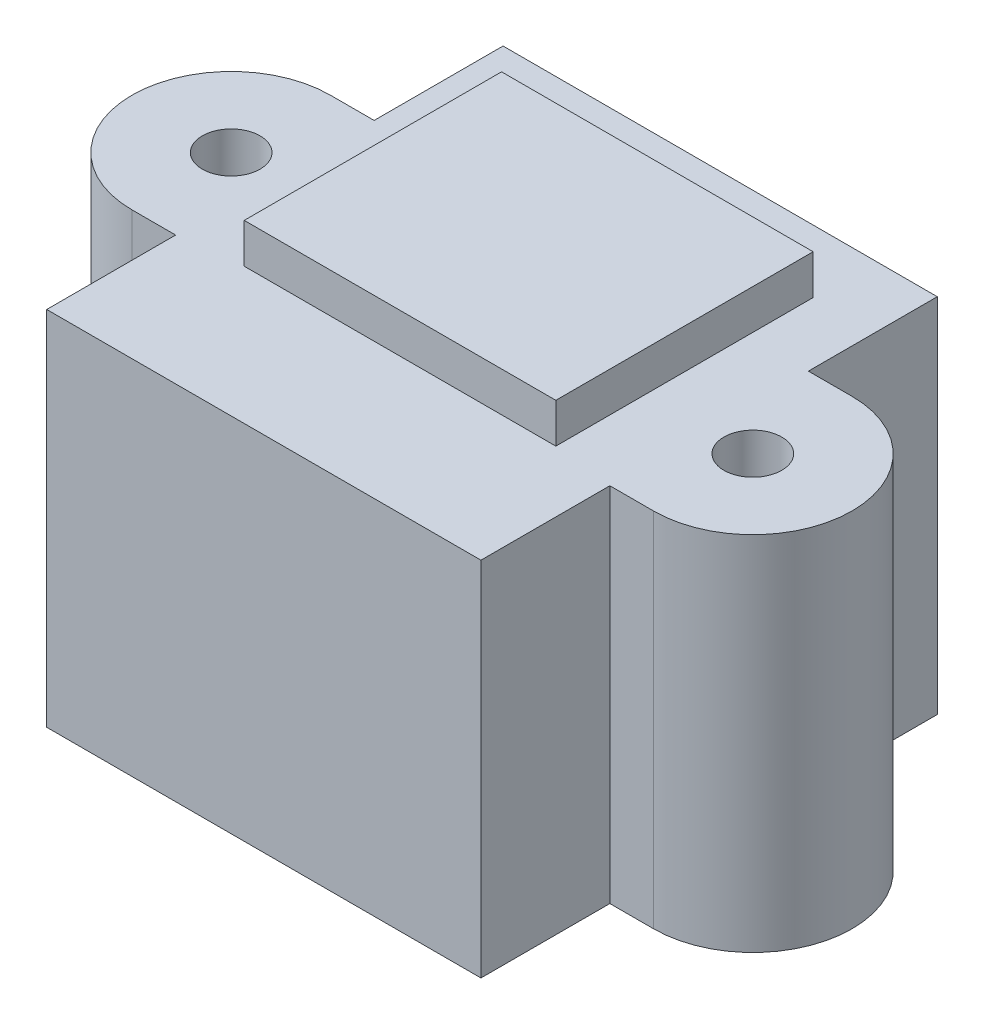
ISO-10303-21;
HEADER;
FILE_DESCRIPTION(('STEP AP214'),'2;1');
FILE_NAME('part.step','',(''),(''),'','','');
FILE_SCHEMA(('AUTOMOTIVE_DESIGN { 1 0 10303 214 1 1 1 1 }'));
ENDSEC;
DATA;
#1=APPLICATION_CONTEXT('core data for automotive mechanical design processes');
#2=APPLICATION_PROTOCOL_DEFINITION('international standard','automotive_design',2000,#1);
#3=PRODUCT_CONTEXT('',#1,'mechanical');
#4=PRODUCT('Part','Part','',(#3));
#5=PRODUCT_RELATED_PRODUCT_CATEGORY('part','',(#4));
#6=PRODUCT_DEFINITION_FORMATION('','',#4);
#7=PRODUCT_DEFINITION_CONTEXT('part definition',#1,'design');
#8=PRODUCT_DEFINITION('design','',#6,#7);
#9=PRODUCT_DEFINITION_SHAPE('','',#8);
#10=(LENGTH_UNIT() NAMED_UNIT(*) SI_UNIT(.MILLI.,.METRE.));
#11=(NAMED_UNIT(*) PLANE_ANGLE_UNIT() SI_UNIT($,.RADIAN.));
#12=(NAMED_UNIT(*) SI_UNIT($,.STERADIAN.) SOLID_ANGLE_UNIT());
#13=UNCERTAINTY_MEASURE_WITH_UNIT(LENGTH_MEASURE(1.E-05),#10,'distance_accuracy_value','');
#14=(GEOMETRIC_REPRESENTATION_CONTEXT(3) GLOBAL_UNCERTAINTY_ASSIGNED_CONTEXT((#13)) GLOBAL_UNIT_ASSIGNED_CONTEXT((#10,
#11,#12)) REPRESENTATION_CONTEXT('',''));
#15=CARTESIAN_POINT('',(0.,0.,0.));
#16=DIRECTION('',(0.,0.,1.));
#17=DIRECTION('',(1.,0.,0.));
#18=AXIS2_PLACEMENT_3D('',#15,#16,#17);
#19=CARTESIAN_POINT('',(0.,18.288,0.));
#20=DIRECTION('',(0.,1.,0.));
#21=DIRECTION('',(0.,0.,1.));
#22=AXIS2_PLACEMENT_3D('',#19,#20,#21);
#23=PLANE('',#22);
#24=CARTESIAN_POINT('',(13.1826,18.288,0.));
#25=DIRECTION('',(0.,1.,0.));
#26=DIRECTION('',(0.,0.,1.));
#27=AXIS2_PLACEMENT_3D('',#24,#25,#26);
#28=CIRCLE('',#27,1.4605);
#29=CARTESIAN_POINT('',(13.1826,18.288,1.4605));
#30=VERTEX_POINT('',#29);
#31=EDGE_CURVE('E290',#30,#30,#28,.T.);
#32=ORIENTED_EDGE('',*,*,#31,.F.);
#33=EDGE_LOOP('',(#32));
#34=FACE_BOUND('',#33,.T.);
#35=CARTESIAN_POINT('',(-13.1826,18.288,0.));
#36=DIRECTION('',(0.,1.,0.));
#37=DIRECTION('',(0.,0.,1.));
#38=AXIS2_PLACEMENT_3D('',#35,#36,#37);
#39=CIRCLE('',#38,1.4605);
#40=CARTESIAN_POINT('',(-13.1826,18.288,1.4605));
#41=VERTEX_POINT('',#40);
#42=EDGE_CURVE('E284',#41,#41,#39,.T.);
#43=ORIENTED_EDGE('',*,*,#42,.F.);
#44=EDGE_LOOP('',(#43));
#45=FACE_BOUND('',#44,.T.);
#46=DIRECTION('',(1.,0.,0.));
#47=VECTOR('',#46,1.);
#48=CARTESIAN_POINT('',(0.,18.288,-5.0165));
#49=LINE('',#48,#47);
#50=CARTESIAN_POINT('',(-13.1826,18.288,-5.0165));
#51=VERTEX_POINT('',#50);
#52=CARTESIAN_POINT('',(-10.9728,18.288,-5.0165));
#53=VERTEX_POINT('',#52);
#54=EDGE_CURVE('E194',#51,#53,#49,.T.);
#55=ORIENTED_EDGE('',*,*,#54,.F.);
#56=CARTESIAN_POINT('',(-13.1826,18.288,0.));
#57=DIRECTION('',(0.,1.,0.));
#58=DIRECTION('',(0.,0.,1.));
#59=AXIS2_PLACEMENT_3D('',#56,#57,#58);
#60=CIRCLE('',#59,5.0165);
#61=CARTESIAN_POINT('',(-13.1826,18.288,5.0165));
#62=VERTEX_POINT('',#61);
#63=EDGE_CURVE('E236',#51,#62,#60,.T.);
#64=ORIENTED_EDGE('',*,*,#63,.T.);
#65=DIRECTION('',(1.,0.,0.));
#66=VECTOR('',#65,1.);
#67=CARTESIAN_POINT('',(0.,18.288,5.0165));
#68=LINE('',#67,#66);
#69=CARTESIAN_POINT('',(-10.9728,18.288,5.0165));
#70=VERTEX_POINT('',#69);
#71=EDGE_CURVE('E218',#62,#70,#68,.T.);
#72=ORIENTED_EDGE('',*,*,#71,.T.);
#73=DIRECTION('',(0.,0.,-1.));
#74=VECTOR('',#73,1.);
#75=CARTESIAN_POINT('',(-10.9728,18.288,0.));
#76=LINE('',#75,#74);
#77=CARTESIAN_POINT('',(-10.9728,18.288,11.5316));
#78=VERTEX_POINT('',#77);
#79=EDGE_CURVE('E231',#78,#70,#76,.T.);
#80=ORIENTED_EDGE('',*,*,#79,.F.);
#81=DIRECTION('',(1.,0.,0.));
#82=VECTOR('',#81,1.);
#83=CARTESIAN_POINT('',(0.,18.288,11.5316));
#84=LINE('',#83,#82);
#85=CARTESIAN_POINT('',(10.9728,18.288,11.5316));
#86=VERTEX_POINT('',#85);
#87=EDGE_CURVE('E232',#78,#86,#84,.T.);
#88=ORIENTED_EDGE('',*,*,#87,.T.);
#89=DIRECTION('',(0.,0.,-1.));
#90=VECTOR('',#89,1.);
#91=CARTESIAN_POINT('',(10.9728,18.288,0.));
#92=LINE('',#91,#90);
#93=CARTESIAN_POINT('',(10.9728,18.288,5.0165));
#94=VERTEX_POINT('',#93);
#95=EDGE_CURVE('E234',#86,#94,#92,.T.);
#96=ORIENTED_EDGE('',*,*,#95,.T.);
#97=DIRECTION('',(1.,0.,0.));
#98=VECTOR('',#97,1.);
#99=CARTESIAN_POINT('',(0.,18.288,5.0165));
#100=LINE('',#99,#98);
#101=CARTESIAN_POINT('',(13.1826,18.288,5.0165));
#102=VERTEX_POINT('',#101);
#103=EDGE_CURVE('E241',#94,#102,#100,.T.);
#104=ORIENTED_EDGE('',*,*,#103,.T.);
#105=CARTESIAN_POINT('',(13.1826,18.288,0.));
#106=DIRECTION('',(0.,1.,0.));
#107=DIRECTION('',(0.,0.,1.));
#108=AXIS2_PLACEMENT_3D('',#105,#106,#107);
#109=CIRCLE('',#108,5.0165);
#110=CARTESIAN_POINT('',(13.1826,18.288,-5.0165));
#111=VERTEX_POINT('',#110);
#112=EDGE_CURVE('E243',#111,#102,#109,.F.);
#113=ORIENTED_EDGE('',*,*,#112,.F.);
#114=DIRECTION('',(1.,0.,0.));
#115=VECTOR('',#114,1.);
#116=CARTESIAN_POINT('',(0.,18.288,-5.0165));
#117=LINE('',#116,#115);
#118=CARTESIAN_POINT('',(10.9728,18.288,-5.0165));
#119=VERTEX_POINT('',#118);
#120=EDGE_CURVE('E144',#119,#111,#117,.T.);
#121=ORIENTED_EDGE('',*,*,#120,.F.);
#122=DIRECTION('',(0.,0.,-1.));
#123=VECTOR('',#122,1.);
#124=CARTESIAN_POINT('',(10.9728,18.288,0.));
#125=LINE('',#124,#123);
#126=CARTESIAN_POINT('',(10.9728,18.288,-11.5316));
#127=VERTEX_POINT('',#126);
#128=EDGE_CURVE('E135',#119,#127,#125,.T.);
#129=ORIENTED_EDGE('',*,*,#128,.T.);
#130=DIRECTION('',(1.,0.,0.));
#131=VECTOR('',#130,1.);
#132=CARTESIAN_POINT('',(0.,18.288,-11.5316));
#133=LINE('',#132,#131);
#134=CARTESIAN_POINT('',(-10.9728,18.288,-11.5316));
#135=VERTEX_POINT('',#134);
#136=EDGE_CURVE('E141',#135,#127,#133,.T.);
#137=ORIENTED_EDGE('',*,*,#136,.F.);
#138=DIRECTION('',(0.,0.,-1.));
#139=VECTOR('',#138,1.);
#140=CARTESIAN_POINT('',(-10.9728,18.288,0.));
#141=LINE('',#140,#139);
#142=EDGE_CURVE('E159',#53,#135,#141,.T.);
#143=ORIENTED_EDGE('',*,*,#142,.F.);
#144=EDGE_LOOP('',(#55,#64,#72,#80,#88,#96,#104,#113,#121,#129,#137,#143));
#145=FACE_BOUND('',#144,.T.);
#146=DIRECTION('',(-1.,0.,0.));
#147=VECTOR('',#146,1.);
#148=CARTESIAN_POINT('',(-7.874,18.288,-8.3566));
#149=LINE('',#148,#147);
#150=CARTESIAN_POINT('',(7.87399999999999,18.288,-8.3566));
#151=VERTEX_POINT('',#150);
#152=CARTESIAN_POINT('',(-7.874,18.288,-8.3566));
#153=VERTEX_POINT('',#152);
#154=EDGE_CURVE('E267',#151,#153,#149,.T.);
#155=ORIENTED_EDGE('',*,*,#154,.F.);
#156=DIRECTION('',(0.,0.,-1.));
#157=VECTOR('',#156,1.);
#158=CARTESIAN_POINT('',(7.87399999999999,18.288,-8.3566));
#159=LINE('',#158,#157);
#160=CARTESIAN_POINT('',(7.874,18.288,4.6482));
#161=VERTEX_POINT('',#160);
#162=EDGE_CURVE('E270',#161,#151,#159,.T.);
#163=ORIENTED_EDGE('',*,*,#162,.F.);
#164=DIRECTION('',(1.,0.,0.));
#165=VECTOR('',#164,1.);
#166=CARTESIAN_POINT('',(-7.874,18.288,4.6482));
#167=LINE('',#166,#165);
#168=CARTESIAN_POINT('',(-7.874,18.288,4.6482));
#169=VERTEX_POINT('',#168);
#170=EDGE_CURVE('E262',#169,#161,#167,.T.);
#171=ORIENTED_EDGE('',*,*,#170,.F.);
#172=DIRECTION('',(0.,0.,1.));
#173=VECTOR('',#172,1.);
#174=CARTESIAN_POINT('',(-7.874,18.288,-8.3566));
#175=LINE('',#174,#173);
#176=EDGE_CURVE('E265',#153,#169,#175,.T.);
#177=ORIENTED_EDGE('',*,*,#176,.F.);
#178=EDGE_LOOP('',(#155,#163,#171,#177));
#179=FACE_BOUND('',#178,.T.);
#180=ADVANCED_FACE('F32',(#34,#45,#145,#179),#23,.T.);
#181=CARTESIAN_POINT('',(0.,18.288,-5.0165));
#182=DIRECTION('',(0.,0.,-1.));
#183=DIRECTION('',(-1.,0.,0.));
#184=AXIS2_PLACEMENT_3D('',#181,#182,#183);
#185=PLANE('',#184);
#186=DIRECTION('',(1.,0.,0.));
#187=VECTOR('',#186,1.);
#188=CARTESIAN_POINT('',(0.,0.,-5.0165));
#189=LINE('',#188,#187);
#190=CARTESIAN_POINT('',(-13.1826,0.,-5.0165));
#191=VERTEX_POINT('',#190);
#192=CARTESIAN_POINT('',(-10.9728,0.,-5.0165));
#193=VERTEX_POINT('',#192);
#194=EDGE_CURVE('E164',#191,#193,#189,.T.);
#195=ORIENTED_EDGE('',*,*,#194,.F.);
#196=DIRECTION('',(0.,-1.,0.));
#197=VECTOR('',#196,1.);
#198=CARTESIAN_POINT('',(-13.1826,18.288,-5.0165));
#199=LINE('',#198,#197);
#200=EDGE_CURVE('E11',#51,#191,#199,.T.);
#201=ORIENTED_EDGE('',*,*,#200,.F.);
#202=ORIENTED_EDGE('',*,*,#54,.T.);
#203=DIRECTION('',(0.,-1.,0.));
#204=VECTOR('',#203,1.);
#205=CARTESIAN_POINT('',(-10.9728,18.288,-5.0165));
#206=LINE('',#205,#204);
#207=EDGE_CURVE('E56',#53,#193,#206,.T.);
#208=ORIENTED_EDGE('',*,*,#207,.T.);
#209=EDGE_LOOP('',(#195,#201,#202,#208));
#210=FACE_BOUND('',#209,.T.);
#211=ADVANCED_FACE('F34',(#210),#185,.T.);
#212=CARTESIAN_POINT('',(-13.1826,18.288,0.));
#213=DIRECTION('',(0.,-1.,0.));
#214=DIRECTION('',(0.,0.,-1.));
#215=AXIS2_PLACEMENT_3D('',#212,#213,#214);
#216=CYLINDRICAL_SURFACE('',#215,5.0165);
#217=CARTESIAN_POINT('',(-13.1826,0.,0.));
#218=DIRECTION('',(0.,1.,0.));
#219=DIRECTION('',(0.,0.,1.));
#220=AXIS2_PLACEMENT_3D('',#217,#218,#219);
#221=CIRCLE('',#220,5.0165);
#222=CARTESIAN_POINT('',(-13.1826,0.,5.0165));
#223=VERTEX_POINT('',#222);
#224=EDGE_CURVE('E166',#191,#223,#221,.T.);
#225=ORIENTED_EDGE('',*,*,#224,.T.);
#226=DIRECTION('',(0.,-1.,0.));
#227=VECTOR('',#226,1.);
#228=CARTESIAN_POINT('',(-13.1826,18.288,5.0165));
#229=LINE('',#228,#227);
#230=EDGE_CURVE('E40',#62,#223,#229,.T.);
#231=ORIENTED_EDGE('',*,*,#230,.F.);
#232=ORIENTED_EDGE('',*,*,#63,.F.);
#233=ORIENTED_EDGE('',*,*,#200,.T.);
#234=EDGE_LOOP('',(#225,#231,#232,#233));
#235=FACE_BOUND('',#234,.T.);
#236=ADVANCED_FACE('F365',(#235),#216,.T.);
#237=CARTESIAN_POINT('',(0.,18.288,5.0165));
#238=DIRECTION('',(0.,0.,-1.));
#239=DIRECTION('',(-1.,0.,0.));
#240=AXIS2_PLACEMENT_3D('',#237,#238,#239);
#241=PLANE('',#240);
#242=DIRECTION('',(1.,0.,0.));
#243=VECTOR('',#242,1.);
#244=CARTESIAN_POINT('',(0.,0.,5.0165));
#245=LINE('',#244,#243);
#246=CARTESIAN_POINT('',(-10.9728,0.,5.0165));
#247=VERTEX_POINT('',#246);
#248=EDGE_CURVE('E169',#223,#247,#245,.T.);
#249=ORIENTED_EDGE('',*,*,#248,.T.);
#250=DIRECTION('',(0.,-1.,0.));
#251=VECTOR('',#250,1.);
#252=CARTESIAN_POINT('',(-10.9728,18.288,5.0165));
#253=LINE('',#252,#251);
#254=EDGE_CURVE('E210',#70,#247,#253,.T.);
#255=ORIENTED_EDGE('',*,*,#254,.F.);
#256=ORIENTED_EDGE('',*,*,#71,.F.);
#257=ORIENTED_EDGE('',*,*,#230,.T.);
#258=EDGE_LOOP('',(#249,#255,#256,#257));
#259=FACE_BOUND('',#258,.T.);
#260=ADVANCED_FACE('F216',(#259),#241,.F.);
#261=CARTESIAN_POINT('',(-10.9728,18.288,0.));
#262=DIRECTION('',(-1.,0.,0.));
#263=DIRECTION('',(0.,0.,1.));
#264=AXIS2_PLACEMENT_3D('',#261,#262,#263);
#265=PLANE('',#264);
#266=DIRECTION('',(0.,0.,-1.));
#267=VECTOR('',#266,1.);
#268=CARTESIAN_POINT('',(-10.9728,0.,0.));
#269=LINE('',#268,#267);
#270=CARTESIAN_POINT('',(-10.9728,0.,11.5316));
#271=VERTEX_POINT('',#270);
#272=EDGE_CURVE('E172',#271,#247,#269,.T.);
#273=ORIENTED_EDGE('',*,*,#272,.F.);
#274=DIRECTION('',(0.,-1.,0.));
#275=VECTOR('',#274,1.);
#276=CARTESIAN_POINT('',(-10.9728,18.288,11.5316));
#277=LINE('',#276,#275);
#278=EDGE_CURVE('E208',#78,#271,#277,.T.);
#279=ORIENTED_EDGE('',*,*,#278,.F.);
#280=ORIENTED_EDGE('',*,*,#79,.T.);
#281=ORIENTED_EDGE('',*,*,#254,.T.);
#282=EDGE_LOOP('',(#273,#279,#280,#281));
#283=FACE_BOUND('',#282,.T.);
#284=ADVANCED_FACE('F227',(#283),#265,.T.);
#285=CARTESIAN_POINT('',(0.,18.288,11.5316));
#286=DIRECTION('',(0.,0.,-1.));
#287=DIRECTION('',(-1.,0.,0.));
#288=AXIS2_PLACEMENT_3D('',#285,#286,#287);
#289=PLANE('',#288);
#290=DIRECTION('',(1.,0.,0.));
#291=VECTOR('',#290,1.);
#292=CARTESIAN_POINT('',(0.,0.,11.5316));
#293=LINE('',#292,#291);
#294=CARTESIAN_POINT('',(10.9728,0.,11.5316));
#295=VERTEX_POINT('',#294);
#296=EDGE_CURVE('E175',#271,#295,#293,.T.);
#297=ORIENTED_EDGE('',*,*,#296,.T.);
#298=DIRECTION('',(0.,-1.,0.));
#299=VECTOR('',#298,1.);
#300=CARTESIAN_POINT('',(10.9728,18.288,11.5316));
#301=LINE('',#300,#299);
#302=EDGE_CURVE('E205',#86,#295,#301,.T.);
#303=ORIENTED_EDGE('',*,*,#302,.F.);
#304=ORIENTED_EDGE('',*,*,#87,.F.);
#305=ORIENTED_EDGE('',*,*,#278,.T.);
#306=EDGE_LOOP('',(#297,#303,#304,#305));
#307=FACE_BOUND('',#306,.T.);
#308=ADVANCED_FACE('F357',(#307),#289,.F.);
#309=CARTESIAN_POINT('',(10.9728,18.288,0.));
#310=DIRECTION('',(-1.,0.,0.));
#311=DIRECTION('',(0.,0.,1.));
#312=AXIS2_PLACEMENT_3D('',#309,#310,#311);
#313=PLANE('',#312);
#314=DIRECTION('',(0.,0.,-1.));
#315=VECTOR('',#314,1.);
#316=CARTESIAN_POINT('',(10.9728,0.,0.));
#317=LINE('',#316,#315);
#318=CARTESIAN_POINT('',(10.9728,0.,5.0165));
#319=VERTEX_POINT('',#318);
#320=EDGE_CURVE('E177',#295,#319,#317,.T.);
#321=ORIENTED_EDGE('',*,*,#320,.T.);
#322=DIRECTION('',(0.,-1.,0.));
#323=VECTOR('',#322,1.);
#324=CARTESIAN_POINT('',(10.9728,18.288,5.0165));
#325=LINE('',#324,#323);
#326=EDGE_CURVE('E202',#94,#319,#325,.T.);
#327=ORIENTED_EDGE('',*,*,#326,.F.);
#328=ORIENTED_EDGE('',*,*,#95,.F.);
#329=ORIENTED_EDGE('',*,*,#302,.T.);
#330=EDGE_LOOP('',(#321,#327,#328,#329));
#331=FACE_BOUND('',#330,.T.);
#332=ADVANCED_FACE('F353',(#331),#313,.F.);
#333=CARTESIAN_POINT('',(0.,18.288,5.0165));
#334=DIRECTION('',(0.,0.,-1.));
#335=DIRECTION('',(-1.,0.,0.));
#336=AXIS2_PLACEMENT_3D('',#333,#334,#335);
#337=PLANE('',#336);
#338=DIRECTION('',(1.,0.,0.));
#339=VECTOR('',#338,1.);
#340=CARTESIAN_POINT('',(0.,0.,5.0165));
#341=LINE('',#340,#339);
#342=CARTESIAN_POINT('',(13.1826,0.,5.0165));
#343=VERTEX_POINT('',#342);
#344=EDGE_CURVE('E179',#319,#343,#341,.T.);
#345=ORIENTED_EDGE('',*,*,#344,.T.);
#346=DIRECTION('',(0.,-1.,0.));
#347=VECTOR('',#346,1.);
#348=CARTESIAN_POINT('',(13.1826,18.288,5.0165));
#349=LINE('',#348,#347);
#350=EDGE_CURVE('E200',#102,#343,#349,.T.);
#351=ORIENTED_EDGE('',*,*,#350,.F.);
#352=ORIENTED_EDGE('',*,*,#103,.F.);
#353=ORIENTED_EDGE('',*,*,#326,.T.);
#354=EDGE_LOOP('',(#345,#351,#352,#353));
#355=FACE_BOUND('',#354,.T.);
#356=ADVANCED_FACE('F349',(#355),#337,.F.);
#357=CARTESIAN_POINT('',(13.1826,18.288,0.));
#358=DIRECTION('',(0.,-1.,0.));
#359=DIRECTION('',(0.,0.,-1.));
#360=AXIS2_PLACEMENT_3D('',#357,#358,#359);
#361=CYLINDRICAL_SURFACE('',#360,5.0165);
#362=CARTESIAN_POINT('',(13.1826,0.,0.));
#363=DIRECTION('',(0.,1.,0.));
#364=DIRECTION('',(0.,0.,1.));
#365=AXIS2_PLACEMENT_3D('',#362,#363,#364);
#366=CIRCLE('',#365,5.0165);
#367=CARTESIAN_POINT('',(13.1826,0.,-5.0165));
#368=VERTEX_POINT('',#367);
#369=EDGE_CURVE('E182',#368,#343,#366,.F.);
#370=ORIENTED_EDGE('',*,*,#369,.F.);
#371=DIRECTION('',(0.,-1.,0.));
#372=VECTOR('',#371,1.);
#373=CARTESIAN_POINT('',(13.1826,18.288,-5.0165));
#374=LINE('',#373,#372);
#375=EDGE_CURVE('E198',#111,#368,#374,.T.);
#376=ORIENTED_EDGE('',*,*,#375,.F.);
#377=ORIENTED_EDGE('',*,*,#112,.T.);
#378=ORIENTED_EDGE('',*,*,#350,.T.);
#379=EDGE_LOOP('',(#370,#376,#377,#378));
#380=FACE_BOUND('',#379,.T.);
#381=ADVANCED_FACE('F346',(#380),#361,.T.);
#382=CARTESIAN_POINT('',(0.,18.288,-5.0165));
#383=DIRECTION('',(0.,0.,-1.));
#384=DIRECTION('',(-1.,0.,0.));
#385=AXIS2_PLACEMENT_3D('',#382,#383,#384);
#386=PLANE('',#385);
#387=DIRECTION('',(1.,0.,0.));
#388=VECTOR('',#387,1.);
#389=CARTESIAN_POINT('',(0.,0.,-5.0165));
#390=LINE('',#389,#388);
#391=CARTESIAN_POINT('',(10.9728,0.,-5.0165));
#392=VERTEX_POINT('',#391);
#393=EDGE_CURVE('E185',#392,#368,#390,.T.);
#394=ORIENTED_EDGE('',*,*,#393,.F.);
#395=DIRECTION('',(0.,-1.,0.));
#396=VECTOR('',#395,1.);
#397=CARTESIAN_POINT('',(10.9728,18.288,-5.0165));
#398=LINE('',#397,#396);
#399=EDGE_CURVE('E155',#119,#392,#398,.T.);
#400=ORIENTED_EDGE('',*,*,#399,.F.);
#401=ORIENTED_EDGE('',*,*,#120,.T.);
#402=ORIENTED_EDGE('',*,*,#375,.T.);
#403=EDGE_LOOP('',(#394,#400,#401,#402));
#404=FACE_BOUND('',#403,.T.);
#405=ADVANCED_FACE('F247',(#404),#386,.T.);
#406=CARTESIAN_POINT('',(10.9728,18.288,0.));
#407=DIRECTION('',(-1.,0.,0.));
#408=DIRECTION('',(0.,0.,1.));
#409=AXIS2_PLACEMENT_3D('',#406,#407,#408);
#410=PLANE('',#409);
#411=DIRECTION('',(0.,0.,-1.));
#412=VECTOR('',#411,1.);
#413=CARTESIAN_POINT('',(10.9728,0.,0.));
#414=LINE('',#413,#412);
#415=CARTESIAN_POINT('',(10.9728,0.,-11.5316));
#416=VERTEX_POINT('',#415);
#417=EDGE_CURVE('E151',#392,#416,#414,.T.);
#418=ORIENTED_EDGE('',*,*,#417,.T.);
#419=DIRECTION('',(0.,-1.,0.));
#420=VECTOR('',#419,1.);
#421=CARTESIAN_POINT('',(10.9728,18.288,-11.5316));
#422=LINE('',#421,#420);
#423=EDGE_CURVE('E148',#127,#416,#422,.T.);
#424=ORIENTED_EDGE('',*,*,#423,.F.);
#425=ORIENTED_EDGE('',*,*,#128,.F.);
#426=ORIENTED_EDGE('',*,*,#399,.T.);
#427=EDGE_LOOP('',(#418,#424,#425,#426));
#428=FACE_BOUND('',#427,.T.);
#429=ADVANCED_FACE('F149',(#428),#410,.F.);
#430=CARTESIAN_POINT('',(0.,18.288,-11.5316));
#431=DIRECTION('',(0.,0.,-1.));
#432=DIRECTION('',(-1.,0.,0.));
#433=AXIS2_PLACEMENT_3D('',#430,#431,#432);
#434=PLANE('',#433);
#435=DIRECTION('',(1.,0.,0.));
#436=VECTOR('',#435,1.);
#437=CARTESIAN_POINT('',(0.,0.,-11.5316));
#438=LINE('',#437,#436);
#439=CARTESIAN_POINT('',(-10.9728,0.,-11.5316));
#440=VERTEX_POINT('',#439);
#441=EDGE_CURVE('E189',#440,#416,#438,.T.);
#442=ORIENTED_EDGE('',*,*,#441,.F.);
#443=DIRECTION('',(0.,-1.,0.));
#444=VECTOR('',#443,1.);
#445=CARTESIAN_POINT('',(-10.9728,18.288,-11.5316));
#446=LINE('',#445,#444);
#447=EDGE_CURVE('E156',#135,#440,#446,.T.);
#448=ORIENTED_EDGE('',*,*,#447,.F.);
#449=ORIENTED_EDGE('',*,*,#136,.T.);
#450=ORIENTED_EDGE('',*,*,#423,.T.);
#451=EDGE_LOOP('',(#442,#448,#449,#450));
#452=FACE_BOUND('',#451,.T.);
#453=ADVANCED_FACE('F158',(#452),#434,.T.);
#454=CARTESIAN_POINT('',(-10.9728,18.288,0.));
#455=DIRECTION('',(-1.,0.,0.));
#456=DIRECTION('',(0.,0.,1.));
#457=AXIS2_PLACEMENT_3D('',#454,#455,#456);
#458=PLANE('',#457);
#459=DIRECTION('',(0.,0.,-1.));
#460=VECTOR('',#459,1.);
#461=CARTESIAN_POINT('',(-10.9728,0.,0.));
#462=LINE('',#461,#460);
#463=EDGE_CURVE('E191',#193,#440,#462,.T.);
#464=ORIENTED_EDGE('',*,*,#463,.F.);
#465=ORIENTED_EDGE('',*,*,#207,.F.);
#466=ORIENTED_EDGE('',*,*,#142,.T.);
#467=ORIENTED_EDGE('',*,*,#447,.T.);
#468=EDGE_LOOP('',(#464,#465,#466,#467));
#469=FACE_BOUND('',#468,.T.);
#470=ADVANCED_FACE('F249',(#469),#458,.T.);
#471=CARTESIAN_POINT('',(0.,0.,0.));
#472=DIRECTION('',(0.,1.,0.));
#473=DIRECTION('',(0.,0.,1.));
#474=AXIS2_PLACEMENT_3D('',#471,#472,#473);
#475=PLANE('',#474);
#476=CARTESIAN_POINT('',(13.1826,0.,0.));
#477=DIRECTION('',(0.,1.,0.));
#478=DIRECTION('',(0.,0.,1.));
#479=AXIS2_PLACEMENT_3D('',#476,#477,#478);
#480=CIRCLE('',#479,1.4605);
#481=CARTESIAN_POINT('',(13.1826,0.,1.4605));
#482=VERTEX_POINT('',#481);
#483=EDGE_CURVE('E287',#482,#482,#480,.T.);
#484=ORIENTED_EDGE('',*,*,#483,.T.);
#485=EDGE_LOOP('',(#484));
#486=FACE_BOUND('',#485,.T.);
#487=CARTESIAN_POINT('',(-13.1826,0.,0.));
#488=DIRECTION('',(0.,1.,0.));
#489=DIRECTION('',(0.,0.,1.));
#490=AXIS2_PLACEMENT_3D('',#487,#488,#489);
#491=CIRCLE('',#490,1.4605);
#492=CARTESIAN_POINT('',(-13.1826,0.,1.4605));
#493=VERTEX_POINT('',#492);
#494=EDGE_CURVE('E273',#493,#493,#491,.T.);
#495=ORIENTED_EDGE('',*,*,#494,.T.);
#496=EDGE_LOOP('',(#495));
#497=FACE_BOUND('',#496,.T.);
#498=ORIENTED_EDGE('',*,*,#194,.T.);
#499=ORIENTED_EDGE('',*,*,#463,.T.);
#500=ORIENTED_EDGE('',*,*,#441,.T.);
#501=ORIENTED_EDGE('',*,*,#417,.F.);
#502=ORIENTED_EDGE('',*,*,#393,.T.);
#503=ORIENTED_EDGE('',*,*,#369,.T.);
#504=ORIENTED_EDGE('',*,*,#344,.F.);
#505=ORIENTED_EDGE('',*,*,#320,.F.);
#506=ORIENTED_EDGE('',*,*,#296,.F.);
#507=ORIENTED_EDGE('',*,*,#272,.T.);
#508=ORIENTED_EDGE('',*,*,#248,.F.);
#509=ORIENTED_EDGE('',*,*,#224,.F.);
#510=EDGE_LOOP('',(#498,#499,#500,#501,#502,#503,#504,#505,#506,#507,#508,#509));
#511=FACE_BOUND('',#510,.T.);
#512=ADVANCED_FACE('F222',(#486,#497,#511),#475,.F.);
#513=CARTESIAN_POINT('',(7.87399999999999,20.2946,-8.3566));
#514=DIRECTION('',(-1.,0.,0.));
#515=DIRECTION('',(0.,0.,1.));
#516=AXIS2_PLACEMENT_3D('',#513,#514,#515);
#517=PLANE('',#516);
#518=ORIENTED_EDGE('',*,*,#162,.T.);
#519=DIRECTION('',(0.,-1.,0.));
#520=VECTOR('',#519,1.);
#521=CARTESIAN_POINT('',(7.87399999999999,20.2946,-8.3566));
#522=LINE('',#521,#520);
#523=CARTESIAN_POINT('',(7.87399999999999,20.2946,-8.3566));
#524=VERTEX_POINT('',#523);
#525=EDGE_CURVE('E167',#524,#151,#522,.T.);
#526=ORIENTED_EDGE('',*,*,#525,.F.);
#527=DIRECTION('',(0.,0.,-1.));
#528=VECTOR('',#527,1.);
#529=CARTESIAN_POINT('',(7.87399999999999,20.2946,-8.3566));
#530=LINE('',#529,#528);
#531=CARTESIAN_POINT('',(7.874,20.2946,4.6482));
#532=VERTEX_POINT('',#531);
#533=EDGE_CURVE('E264',#532,#524,#530,.T.);
#534=ORIENTED_EDGE('',*,*,#533,.F.);
#535=DIRECTION('',(0.,-1.,0.));
#536=VECTOR('',#535,1.);
#537=CARTESIAN_POINT('',(7.874,20.2946,4.6482));
#538=LINE('',#537,#536);
#539=EDGE_CURVE('E258',#532,#161,#538,.T.);
#540=ORIENTED_EDGE('',*,*,#539,.T.);
#541=EDGE_LOOP('',(#518,#526,#534,#540));
#542=FACE_BOUND('',#541,.T.);
#543=ADVANCED_FACE('F331',(#542),#517,.F.);
#544=CARTESIAN_POINT('',(-7.874,20.2946,-8.3566));
#545=DIRECTION('',(0.,0.,1.));
#546=DIRECTION('',(1.,0.,0.));
#547=AXIS2_PLACEMENT_3D('',#544,#545,#546);
#548=PLANE('',#547);
#549=ORIENTED_EDGE('',*,*,#154,.T.);
#550=DIRECTION('',(0.,-1.,0.));
#551=VECTOR('',#550,1.);
#552=CARTESIAN_POINT('',(-7.874,20.2946,-8.3566));
#553=LINE('',#552,#551);
#554=CARTESIAN_POINT('',(-7.874,20.2946,-8.3566));
#555=VERTEX_POINT('',#554);
#556=EDGE_CURVE('E254',#555,#153,#553,.T.);
#557=ORIENTED_EDGE('',*,*,#556,.F.);
#558=DIRECTION('',(-1.,0.,0.));
#559=VECTOR('',#558,1.);
#560=CARTESIAN_POINT('',(-7.874,20.2946,-8.3566));
#561=LINE('',#560,#559);
#562=EDGE_CURVE('E279',#524,#555,#561,.T.);
#563=ORIENTED_EDGE('',*,*,#562,.F.);
#564=ORIENTED_EDGE('',*,*,#525,.T.);
#565=EDGE_LOOP('',(#549,#557,#563,#564));
#566=FACE_BOUND('',#565,.T.);
#567=ADVANCED_FACE('F327',(#566),#548,.F.);
#568=CARTESIAN_POINT('',(-7.874,20.2946,-8.3566));
#569=DIRECTION('',(1.,0.,0.));
#570=DIRECTION('',(0.,0.,-1.));
#571=AXIS2_PLACEMENT_3D('',#568,#569,#570);
#572=PLANE('',#571);
#573=ORIENTED_EDGE('',*,*,#176,.T.);
#574=DIRECTION('',(0.,-1.,0.));
#575=VECTOR('',#574,1.);
#576=CARTESIAN_POINT('',(-7.874,20.2946,4.6482));
#577=LINE('',#576,#575);
#578=CARTESIAN_POINT('',(-7.874,20.2946,4.6482));
#579=VERTEX_POINT('',#578);
#580=EDGE_CURVE('E47',#579,#169,#577,.T.);
#581=ORIENTED_EDGE('',*,*,#580,.F.);
#582=DIRECTION('',(0.,0.,1.));
#583=VECTOR('',#582,1.);
#584=CARTESIAN_POINT('',(-7.874,20.2946,-8.3566));
#585=LINE('',#584,#583);
#586=EDGE_CURVE('E276',#555,#579,#585,.T.);
#587=ORIENTED_EDGE('',*,*,#586,.F.);
#588=ORIENTED_EDGE('',*,*,#556,.T.);
#589=EDGE_LOOP('',(#573,#581,#587,#588));
#590=FACE_BOUND('',#589,.T.);
#591=ADVANCED_FACE('F324',(#590),#572,.F.);
#592=CARTESIAN_POINT('',(-7.874,20.2946,4.6482));
#593=DIRECTION('',(0.,0.,-1.));
#594=DIRECTION('',(-1.,0.,0.));
#595=AXIS2_PLACEMENT_3D('',#592,#593,#594);
#596=PLANE('',#595);
#597=ORIENTED_EDGE('',*,*,#170,.T.);
#598=ORIENTED_EDGE('',*,*,#539,.F.);
#599=DIRECTION('',(1.,0.,0.));
#600=VECTOR('',#599,1.);
#601=CARTESIAN_POINT('',(-7.874,20.2946,4.6482));
#602=LINE('',#601,#600);
#603=EDGE_CURVE('E261',#579,#532,#602,.T.);
#604=ORIENTED_EDGE('',*,*,#603,.F.);
#605=ORIENTED_EDGE('',*,*,#580,.T.);
#606=EDGE_LOOP('',(#597,#598,#604,#605));
#607=FACE_BOUND('',#606,.T.);
#608=ADVANCED_FACE('F317',(#607),#596,.F.);
#609=CARTESIAN_POINT('',(0.,20.2946,0.));
#610=DIRECTION('',(0.,1.,0.));
#611=DIRECTION('',(0.,0.,1.));
#612=AXIS2_PLACEMENT_3D('',#609,#610,#611);
#613=PLANE('',#612);
#614=ORIENTED_EDGE('',*,*,#533,.T.);
#615=ORIENTED_EDGE('',*,*,#562,.T.);
#616=ORIENTED_EDGE('',*,*,#586,.T.);
#617=ORIENTED_EDGE('',*,*,#603,.T.);
#618=EDGE_LOOP('',(#614,#615,#616,#617));
#619=FACE_BOUND('',#618,.T.);
#620=ADVANCED_FACE('F311',(#619),#613,.T.);
#621=CARTESIAN_POINT('',(-13.1826,0.,0.));
#622=DIRECTION('',(0.,1.,0.));
#623=DIRECTION('',(0.,0.,1.));
#624=AXIS2_PLACEMENT_3D('',#621,#622,#623);
#625=CYLINDRICAL_SURFACE('',#624,1.4605);
#626=ORIENTED_EDGE('',*,*,#494,.F.);
#627=EDGE_LOOP('',(#626));
#628=FACE_BOUND('',#627,.T.);
#629=ORIENTED_EDGE('',*,*,#42,.T.);
#630=EDGE_LOOP('',(#629));
#631=FACE_BOUND('',#630,.T.);
#632=ADVANCED_FACE('F301',(#628,#631),#625,.F.);
#633=CARTESIAN_POINT('',(13.1826,0.,0.));
#634=DIRECTION('',(0.,1.,0.));
#635=DIRECTION('',(0.,0.,1.));
#636=AXIS2_PLACEMENT_3D('',#633,#634,#635);
#637=CYLINDRICAL_SURFACE('',#636,1.4605);
#638=ORIENTED_EDGE('',*,*,#483,.F.);
#639=EDGE_LOOP('',(#638));
#640=FACE_BOUND('',#639,.T.);
#641=ORIENTED_EDGE('',*,*,#31,.T.);
#642=EDGE_LOOP('',(#641));
#643=FACE_BOUND('',#642,.T.);
#644=ADVANCED_FACE('F298',(#640,#643),#637,.F.);
#645=CLOSED_SHELL('',(#180,#211,#236,#260,#284,#308,#332,#356,#381,#405,#429,#453,#470,#512,
#543,#567,#591,#608,#620,#632,#644));
#646=MANIFOLD_SOLID_BREP('B2',#645);
#647=ADVANCED_BREP_SHAPE_REPRESENTATION('',(#18,#646),#14);
#648=SHAPE_DEFINITION_REPRESENTATION(#9,#647);
ENDSEC;
END-ISO-10303-21;
